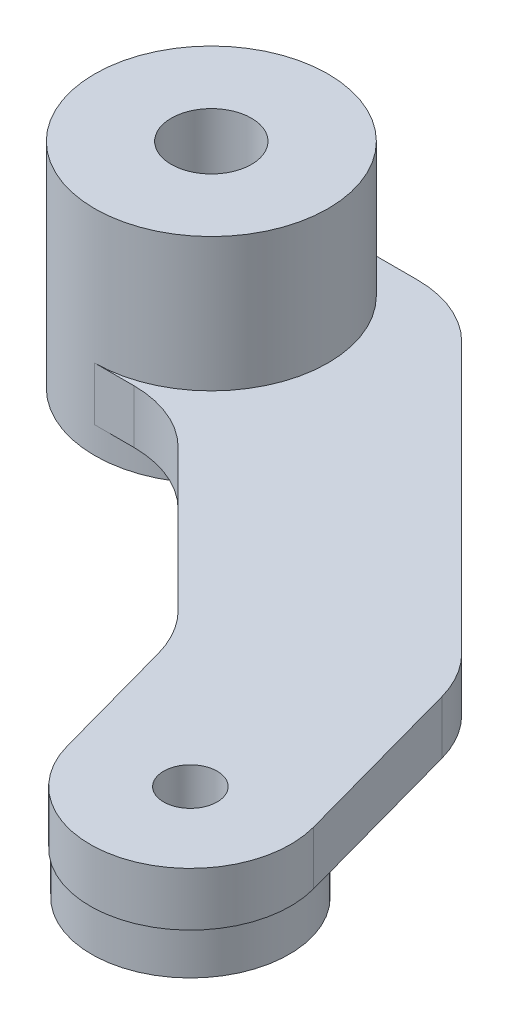
ISO-10303-21;
HEADER;
FILE_DESCRIPTION(('STEP AP214'),'2;1');
FILE_NAME('part.step','',(''),(''),'','','');
FILE_SCHEMA(('AUTOMOTIVE_DESIGN { 1 0 10303 214 1 1 1 1 }'));
ENDSEC;
DATA;
#1=APPLICATION_CONTEXT('core data for automotive mechanical design processes');
#2=APPLICATION_PROTOCOL_DEFINITION('international standard','automotive_design',2000,#1);
#3=PRODUCT_CONTEXT('',#1,'mechanical');
#4=PRODUCT('Part','Part','',(#3));
#5=PRODUCT_RELATED_PRODUCT_CATEGORY('part','',(#4));
#6=PRODUCT_DEFINITION_FORMATION('','',#4);
#7=PRODUCT_DEFINITION_CONTEXT('part definition',#1,'design');
#8=PRODUCT_DEFINITION('design','',#6,#7);
#9=PRODUCT_DEFINITION_SHAPE('','',#8);
#10=(LENGTH_UNIT() NAMED_UNIT(*) SI_UNIT(.MILLI.,.METRE.));
#11=(NAMED_UNIT(*) PLANE_ANGLE_UNIT() SI_UNIT($,.RADIAN.));
#12=(NAMED_UNIT(*) SI_UNIT($,.STERADIAN.) SOLID_ANGLE_UNIT());
#13=UNCERTAINTY_MEASURE_WITH_UNIT(LENGTH_MEASURE(1.E-05),#10,'distance_accuracy_value','');
#14=(GEOMETRIC_REPRESENTATION_CONTEXT(3) GLOBAL_UNCERTAINTY_ASSIGNED_CONTEXT((#13)) GLOBAL_UNIT_ASSIGNED_CONTEXT((#10,
#11,#12)) REPRESENTATION_CONTEXT('',''));
#15=CARTESIAN_POINT('',(0.,0.,0.));
#16=DIRECTION('',(0.,0.,1.));
#17=DIRECTION('',(1.,0.,0.));
#18=AXIS2_PLACEMENT_3D('',#15,#16,#17);
#19=CARTESIAN_POINT('',(0.,0.,0.));
#20=DIRECTION('',(0.,1.,0.));
#21=DIRECTION('',(0.,0.,1.));
#22=AXIS2_PLACEMENT_3D('',#19,#20,#21);
#23=PLANE('',#22);
#24=DIRECTION('',(0.714270427425469,0.,0.699869813969311));
#25=VECTOR('',#24,1.);
#26=CARTESIAN_POINT('',(2.33472867718182,0.,-2.38276836189749));
#27=LINE('',#26,#25);
#28=CARTESIAN_POINT('',(5.08889116016265,0.,0.315866651668403));
#29=VERTEX_POINT('',#28);
#30=CARTESIAN_POINT('',(13.2174816160493,0.,8.28057423546057));
#31=VERTEX_POINT('',#30);
#32=EDGE_CURVE('E406',#29,#31,#27,.T.);
#33=ORIENTED_EDGE('',*,*,#32,.F.);
#34=DIRECTION('',(-0.699869813969311,0.,0.714270427425469));
#35=VECTOR('',#34,1.);
#36=CARTESIAN_POINT('',(14.3721259194862,0.,-9.15838116854661));
#37=LINE('',#36,#35);
#38=CARTESIAN_POINT('',(4.38902134619334,0.,1.03013707909387));
#39=VERTEX_POINT('',#38);
#40=EDGE_CURVE('E479',#29,#39,#37,.T.);
#41=ORIENTED_EDGE('',*,*,#40,.T.);
#42=DIRECTION('',(-0.714270427425468,0.,-0.699869813969311));
#43=VECTOR('',#42,1.);
#44=CARTESIAN_POINT('',(1.63485886321251,0.,-1.66849793447202));
#45=LINE('',#44,#43);
#46=CARTESIAN_POINT('',(12.3516412815211,0.,8.83222032217718));
#47=VERTEX_POINT('',#46);
#48=EDGE_CURVE('E472',#47,#39,#45,.T.);
#49=ORIENTED_EDGE('',*,*,#48,.F.);
#50=DIRECTION('',(-0.332503401905546,0.,-0.943102055835549));
#51=VECTOR('',#50,1.);
#52=CARTESIAN_POINT('',(8.21641355024007,0.,-2.89680786932144));
#53=LINE('',#52,#51);
#54=CARTESIAN_POINT('',(13.823828400913,0.,13.0078849647527));
#55=VERTEX_POINT('',#54);
#56=EDGE_CURVE('E466',#55,#47,#53,.T.);
#57=ORIENTED_EDGE('',*,*,#56,.F.);
#58=CARTESIAN_POINT('',(15.5134984701017,0.,16.2966673040273));
#59=DIRECTION('',(0.,-1.,0.));
#60=DIRECTION('',(0.,0.,-1.));
#61=AXIS2_PLACEMENT_3D('',#58,#59,#60);
#62=CIRCLE('',#61,3.69744157733922);
#63=CARTESIAN_POINT('',(14.7669304567485,0.,12.6753815628471));
#64=VERTEX_POINT('',#63);
#65=EDGE_CURVE('E61',#64,#55,#62,.T.);
#66=ORIENTED_EDGE('',*,*,#65,.F.);
#67=DIRECTION('',(0.332503401905546,0.,0.943102055835549));
#68=VECTOR('',#67,1.);
#69=CARTESIAN_POINT('',(9.15951560607562,0.,-3.22931127122699));
#70=LINE('',#69,#68);
#71=EDGE_CURVE('E467',#31,#64,#70,.T.);
#72=ORIENTED_EDGE('',*,*,#71,.F.);
#73=EDGE_LOOP('',(#33,#41,#49,#57,#66,#72));
#74=FACE_BOUND('',#73,.T.);
#75=CARTESIAN_POINT('',(0.,0.,0.));
#76=DIRECTION('',(0.,-1.,0.));
#77=DIRECTION('',(0.,0.,-1.));
#78=AXIS2_PLACEMENT_3D('',#75,#76,#77);
#79=CIRCLE('',#78,4.365625);
#80=CARTESIAN_POINT('',(0.,0.,-4.365625));
#81=VERTEX_POINT('',#80);
#82=CARTESIAN_POINT('',(0.,0.,4.365625));
#83=VERTEX_POINT('',#82);
#84=EDGE_CURVE('E190',#81,#83,#79,.T.);
#85=ORIENTED_EDGE('',*,*,#84,.F.);
#86=DIRECTION('',(1.,0.,0.));
#87=VECTOR('',#86,1.);
#88=CARTESIAN_POINT('',(0.,0.,-4.365625));
#89=LINE('',#88,#87);
#90=CARTESIAN_POINT('',(3.3431457505076,0.,-4.365625));
#91=VERTEX_POINT('',#90);
#92=EDGE_CURVE('E360',#81,#91,#89,.T.);
#93=ORIENTED_EDGE('',*,*,#92,.T.);
#94=CARTESIAN_POINT('',(3.34314575050762,0.,-0.365625));
#95=DIRECTION('',(0.,1.,0.));
#96=DIRECTION('',(0.,0.,1.));
#97=AXIS2_PLACEMENT_3D('',#94,#95,#96);
#98=CIRCLE('',#97,4.);
#99=CARTESIAN_POINT('',(6.17157287525382,0.,-3.19405212474617));
#100=VERTEX_POINT('',#99);
#101=EDGE_CURVE('E357',#91,#100,#98,.F.);
#102=ORIENTED_EDGE('',*,*,#101,.T.);
#103=DIRECTION('',(0.707106781186546,0.,0.707106781186549));
#104=VECTOR('',#103,1.);
#105=CARTESIAN_POINT('',(4.68281250000001,0.,-4.68281249999999));
#106=LINE('',#105,#104);
#107=CARTESIAN_POINT('',(16.2738952249581,0.,6.90827022495812));
#108=VERTEX_POINT('',#107);
#109=EDGE_CURVE('E355',#100,#108,#106,.T.);
#110=ORIENTED_EDGE('',*,*,#109,.T.);
#111=CARTESIAN_POINT('',(13.4454681002119,0.,9.73669734970432));
#112=DIRECTION('',(0.,1.,0.));
#113=DIRECTION('',(0.,0.,1.));
#114=AXIS2_PLACEMENT_3D('',#111,#112,#113);
#115=CIRCLE('',#114,4.);
#116=CARTESIAN_POINT('',(17.3015809451535,0.,8.67349759092112));
#117=VERTEX_POINT('',#116);
#118=EDGE_CURVE('E352',#108,#117,#115,.F.);
#119=ORIENTED_EDGE('',*,*,#118,.T.);
#120=DIRECTION('',(0.265799939695803,0.,0.964028211235391));
#121=VECTOR('',#120,1.);
#122=CARTESIAN_POINT('',(13.8567458042872,0.,-3.82055437406726));
#123=LINE('',#122,#121);
#124=CARTESIAN_POINT('',(19.1286042622344,0.,15.299917530168));
#125=VERTEX_POINT('',#124);
#126=EDGE_CURVE('E349',#117,#125,#123,.T.);
#127=ORIENTED_EDGE('',*,*,#126,.T.);
#128=CARTESIAN_POINT('',(15.5134984701017,0.,16.2966673040273));
#129=DIRECTION('',(0.,1.,0.));
#130=DIRECTION('',(0.,0.,1.));
#131=AXIS2_PLACEMENT_3D('',#128,#129,#130);
#132=CIRCLE('',#131,3.75);
#133=CARTESIAN_POINT('',(11.898392677969,0.,17.2934170778865));
#134=VERTEX_POINT('',#133);
#135=EDGE_CURVE('E343',#134,#125,#132,.T.);
#136=ORIENTED_EDGE('',*,*,#135,.F.);
#137=DIRECTION('',(0.265799939695804,0.,0.964028211235391));
#138=VECTOR('',#137,1.);
#139=CARTESIAN_POINT('',(6.62653422002174,0.,-1.82705482634874));
#140=LINE('',#139,#138);
#141=CARTESIAN_POINT('',(10.5978049827296,0.,12.5763233462955));
#142=VERTEX_POINT('',#141);
#143=EDGE_CURVE('E341',#142,#134,#140,.T.);
#144=ORIENTED_EDGE('',*,*,#143,.F.);
#145=CARTESIAN_POINT('',(6.74169213778806,0.,13.6395231050787));
#146=DIRECTION('',(0.,1.,0.));
#147=DIRECTION('',(0.,0.,1.));
#148=AXIS2_PLACEMENT_3D('',#145,#146,#147);
#149=CIRCLE('',#148,4.);
#150=CARTESIAN_POINT('',(9.57011926253424,0.,10.8110959803325));
#151=VERTEX_POINT('',#150);
#152=EDGE_CURVE('E331',#151,#142,#149,.F.);
#153=ORIENTED_EDGE('',*,*,#152,.F.);
#154=DIRECTION('',(0.707106781186548,0.,0.707106781186548));
#155=VECTOR('',#154,1.);
#156=CARTESIAN_POINT('',(-0.62048835889911,0.,0.62048835889911));
#157=LINE('',#156,#155);
#158=CARTESIAN_POINT('',(4.2962211574556,0.,5.53719787525382));
#159=VERTEX_POINT('',#158);
#160=EDGE_CURVE('E321',#159,#151,#157,.T.);
#161=ORIENTED_EDGE('',*,*,#160,.F.);
#162=CARTESIAN_POINT('',(1.4677940327094,0.,8.365625));
#163=DIRECTION('',(0.,1.,0.));
#164=DIRECTION('',(0.,0.,1.));
#165=AXIS2_PLACEMENT_3D('',#162,#163,#164);
#166=CIRCLE('',#165,4.);
#167=CARTESIAN_POINT('',(1.46779403270938,0.,4.365625));
#168=VERTEX_POINT('',#167);
#169=EDGE_CURVE('E332',#159,#168,#166,.T.);
#170=ORIENTED_EDGE('',*,*,#169,.T.);
#171=DIRECTION('',(1.,0.,0.));
#172=VECTOR('',#171,1.);
#173=CARTESIAN_POINT('',(0.,0.,4.365625));
#174=LINE('',#173,#172);
#175=EDGE_CURVE('E363',#83,#168,#174,.T.);
#176=ORIENTED_EDGE('',*,*,#175,.F.);
#177=EDGE_LOOP('',(#85,#93,#102,#110,#119,#127,#136,#144,#153,#161,#170,#176));
#178=FACE_BOUND('',#177,.T.);
#179=ADVANCED_FACE('F39',(#74,#178),#23,.F.);
#180=CARTESIAN_POINT('',(9.15951560607562,-1.5875,-3.22931127122699));
#181=DIRECTION('',(-0.943102055835549,0.,0.332503401905546));
#182=DIRECTION('',(0.332503401905546,0.,0.943102055835549));
#183=AXIS2_PLACEMENT_3D('',#180,#181,#182);
#184=PLANE('',#183);
#185=DIRECTION('',(-0.330681069592284,0.104552607721741,-0.937933250520466));
#186=VECTOR('',#185,1.);
#187=CARTESIAN_POINT('',(9.16592610778326,0.183389429102031,-3.21112872841762));
#188=LINE('',#187,#186);
#189=CARTESIAN_POINT('',(14.7669304567485,-1.5875,12.6753815628471));
#190=VERTEX_POINT('',#189);
#191=CARTESIAN_POINT('',(13.2174816160493,-1.09760525934771,8.28057423546057));
#192=VERTEX_POINT('',#191);
#193=EDGE_CURVE('E393',#190,#192,#188,.T.);
#194=ORIENTED_EDGE('',*,*,#193,.T.);
#195=DIRECTION('',(0.,1.,0.));
#196=VECTOR('',#195,1.);
#197=CARTESIAN_POINT('',(13.2174816160493,-1.5875,8.28057423546057));
#198=LINE('',#197,#196);
#199=EDGE_CURVE('E400',#192,#31,#198,.T.);
#200=ORIENTED_EDGE('',*,*,#199,.T.);
#201=ORIENTED_EDGE('',*,*,#71,.T.);
#202=DIRECTION('',(0.,1.,0.));
#203=VECTOR('',#202,1.);
#204=CARTESIAN_POINT('',(14.7669304567485,-1.5875,12.6753815628471));
#205=LINE('',#204,#203);
#206=EDGE_CURVE('E401',#190,#64,#205,.T.);
#207=ORIENTED_EDGE('',*,*,#206,.F.);
#208=EDGE_LOOP('',(#194,#200,#201,#207));
#209=FACE_BOUND('',#208,.T.);
#210=ADVANCED_FACE('F257',(#209),#184,.F.);
#211=CARTESIAN_POINT('',(8.21641355024007,-1.5875,-2.89680786932144));
#212=DIRECTION('',(0.943102055835549,0.,-0.332503401905546));
#213=DIRECTION('',(-0.332503401905546,0.,-0.943102055835549));
#214=AXIS2_PLACEMENT_3D('',#211,#212,#213);
#215=PLANE('',#214);
#216=DIRECTION('',(-0.330681069592284,0.104552607721741,-0.937933250520466));
#217=VECTOR('',#216,1.);
#218=CARTESIAN_POINT('',(8.27770959138597,0.166036073249032,-2.72294973106486));
#219=LINE('',#218,#217);
#220=CARTESIAN_POINT('',(13.823828400913,-1.5875,13.0078849647527));
#221=VERTEX_POINT('',#220);
#222=CARTESIAN_POINT('',(12.3516412815211,-1.12203337205981,8.83222032217718));
#223=VERTEX_POINT('',#222);
#224=EDGE_CURVE('E395',#221,#223,#219,.T.);
#225=ORIENTED_EDGE('',*,*,#224,.F.);
#226=DIRECTION('',(0.,1.,0.));
#227=VECTOR('',#226,1.);
#228=CARTESIAN_POINT('',(13.823828400913,-1.5875,13.0078849647527));
#229=LINE('',#228,#227);
#230=EDGE_CURVE('E410',#221,#55,#229,.T.);
#231=ORIENTED_EDGE('',*,*,#230,.T.);
#232=ORIENTED_EDGE('',*,*,#56,.T.);
#233=DIRECTION('',(0.,1.,0.));
#234=VECTOR('',#233,1.);
#235=CARTESIAN_POINT('',(12.3516412815211,-1.5875,8.83222032217718));
#236=LINE('',#235,#234);
#237=EDGE_CURVE('E407',#223,#47,#236,.T.);
#238=ORIENTED_EDGE('',*,*,#237,.F.);
#239=EDGE_LOOP('',(#225,#231,#232,#238));
#240=FACE_BOUND('',#239,.T.);
#241=ADVANCED_FACE('F253',(#240),#215,.F.);
#242=CARTESIAN_POINT('',(1.63485886321251,-1.5875,-1.66849793447202));
#243=DIRECTION('',(0.699869813969311,0.,-0.714270427425468));
#244=DIRECTION('',(-0.714270427425468,0.,-0.699869813969311));
#245=AXIS2_PLACEMENT_3D('',#242,#243,#244);
#246=PLANE('',#245);
#247=ORIENTED_EDGE('',*,*,#48,.T.);
#248=CARTESIAN_POINT('',(4.82547040914751,-0.0461163851207022,1.4577867657788));
#249=CARTESIAN_POINT('',(4.69876645622606,-0.0280031988042814,1.33363732803722));
#250=CARTESIAN_POINT('',(4.51550134687671,0.,1.15406707976347));
#251=CARTESIAN_POINT('',(4.38902134619334,0.,1.03013707909387));
#252=B_SPLINE_CURVE_WITH_KNOTS('',3,(#248,#249,#250,#251),.UNSPECIFIED.,.F.,.F.,(4,4),(0.,1.),.UNSPECIFIED.);
#253=CARTESIAN_POINT('',(4.82547040914751,-0.0461163851207022,1.4577867657788));
#254=VERTEX_POINT('',#253);
#255=EDGE_CURVE('E478',#254,#39,#252,.T.);
#256=ORIENTED_EDGE('',*,*,#255,.F.);
#257=DIRECTION('',(-0.710575657353192,0.101581592182295,-0.696249535229137));
#258=VECTOR('',#257,1.);
#259=CARTESIAN_POINT('',(12.3516412815211,-1.12203337205981,8.83222032217718));
#260=LINE('',#259,#258);
#261=EDGE_CURVE('E212',#223,#254,#260,.T.);
#262=ORIENTED_EDGE('',*,*,#261,.F.);
#263=ORIENTED_EDGE('',*,*,#237,.T.);
#264=EDGE_LOOP('',(#247,#256,#262,#263));
#265=FACE_BOUND('',#264,.T.);
#266=ADVANCED_FACE('F249',(#265),#246,.F.);
#267=CARTESIAN_POINT('',(2.33472867718182,-1.5875,-2.38276836189749));
#268=DIRECTION('',(-0.699869813969311,0.,0.714270427425468));
#269=DIRECTION('',(0.714270427425469,0.,0.699869813969311));
#270=AXIS2_PLACEMENT_3D('',#267,#268,#269);
#271=PLANE('',#270);
#272=DIRECTION('',(-0.710575657353192,0.101581592182295,-0.696249535229137));
#273=VECTOR('',#272,1.);
#274=CARTESIAN_POINT('',(2.4789112604941,0.389391222395966,-2.24149268550683));
#275=LINE('',#274,#273);
#276=CARTESIAN_POINT('',(12.8806334603265,-1.09760525934771,7.95051737319994));
#277=VERTEX_POINT('',#276);
#278=CARTESIAN_POINT('',(5.52534022311682,-0.0461163851207024,0.743516338353334));
#279=VERTEX_POINT('',#278);
#280=EDGE_CURVE('E492',#277,#279,#275,.T.);
#281=ORIENTED_EDGE('',*,*,#280,.T.);
#282=CARTESIAN_POINT('',(5.52534022311682,-0.0461163851207022,0.743516338353331));
#283=CARTESIAN_POINT('',(5.39863627019537,-0.0280031988042814,0.619366900611748));
#284=CARTESIAN_POINT('',(5.21537116084603,0.,0.439796652337995));
#285=CARTESIAN_POINT('',(5.08889116016265,0.,0.315866651668401));
#286=B_SPLINE_CURVE_WITH_KNOTS('',3,(#282,#283,#284,#285),.UNSPECIFIED.,.F.,.F.,(4,4),(0.,1.),.UNSPECIFIED.);
#287=EDGE_CURVE('E402',#279,#29,#286,.T.);
#288=ORIENTED_EDGE('',*,*,#287,.T.);
#289=ORIENTED_EDGE('',*,*,#32,.T.);
#290=ORIENTED_EDGE('',*,*,#199,.F.);
#291=DIRECTION('',(0.714270427425469,0.,0.699869813969311));
#292=VECTOR('',#291,1.);
#293=CARTESIAN_POINT('',(2.33472867718182,-1.09760525934771,-2.38276836189749));
#294=LINE('',#293,#292);
#295=EDGE_CURVE('E47',#277,#192,#294,.T.);
#296=ORIENTED_EDGE('',*,*,#295,.F.);
#297=EDGE_LOOP('',(#281,#288,#289,#290,#296));
#298=FACE_BOUND('',#297,.T.);
#299=ADVANCED_FACE('F245',(#298),#271,.F.);
#300=CARTESIAN_POINT('',(0.,-1.5875,0.));
#301=DIRECTION('',(0.,-1.,0.));
#302=DIRECTION('',(0.,0.,-1.));
#303=AXIS2_PLACEMENT_3D('',#300,#301,#302);
#304=PLANE('',#303);
#305=CARTESIAN_POINT('',(15.5134984701017,-1.5875,16.2966673040273));
#306=DIRECTION('',(0.,-1.,0.));
#307=DIRECTION('',(0.,0.,-1.));
#308=AXIS2_PLACEMENT_3D('',#305,#306,#307);
#309=CIRCLE('',#308,1.00000000000001);
#310=CARTESIAN_POINT('',(15.5134984701017,-1.5875,15.2966673040273));
#311=VERTEX_POINT('',#310);
#312=EDGE_CURVE('E408',#311,#311,#309,.F.);
#313=ORIENTED_EDGE('',*,*,#312,.T.);
#314=EDGE_LOOP('',(#313));
#315=FACE_BOUND('',#314,.T.);
#316=CARTESIAN_POINT('',(15.5134984701017,-1.5875,16.2966673040273));
#317=DIRECTION('',(0.,-1.,0.));
#318=DIRECTION('',(0.,0.,-1.));
#319=AXIS2_PLACEMENT_3D('',#316,#317,#318);
#320=CIRCLE('',#319,3.69744157733922);
#321=EDGE_CURVE('E413',#190,#221,#320,.T.);
#322=ORIENTED_EDGE('',*,*,#321,.T.);
#323=DIRECTION('',(0.943102055835549,0.,-0.332503401905546));
#324=VECTOR('',#323,1.);
#325=CARTESIAN_POINT('',(5.6074148506729,-1.5875,15.9046928340741));
#326=LINE('',#325,#324);
#327=EDGE_CURVE('E384',#221,#190,#326,.T.);
#328=ORIENTED_EDGE('',*,*,#327,.T.);
#329=EDGE_LOOP('',(#322,#328));
#330=FACE_BOUND('',#329,.T.);
#331=ADVANCED_FACE('F242',(#315,#330),#304,.T.);
#332=CARTESIAN_POINT('',(1.4677940327094,2.,8.365625));
#333=DIRECTION('',(0.,-1.,0.));
#334=DIRECTION('',(0.,0.,-1.));
#335=AXIS2_PLACEMENT_3D('',#332,#333,#334);
#336=CYLINDRICAL_SURFACE('',#335,4.);
#337=ORIENTED_EDGE('',*,*,#169,.F.);
#338=DIRECTION('',(0.,-1.,0.));
#339=VECTOR('',#338,1.);
#340=CARTESIAN_POINT('',(4.2962211574556,2.,5.53719787525382));
#341=LINE('',#340,#339);
#342=CARTESIAN_POINT('',(4.2962211574556,2.,5.53719787525382));
#343=VERTEX_POINT('',#342);
#344=EDGE_CURVE('E326',#343,#159,#341,.T.);
#345=ORIENTED_EDGE('',*,*,#344,.F.);
#346=CARTESIAN_POINT('',(1.4677940327094,2.,8.365625));
#347=DIRECTION('',(0.,1.,0.));
#348=DIRECTION('',(0.,0.,1.));
#349=AXIS2_PLACEMENT_3D('',#346,#347,#348);
#350=CIRCLE('',#349,4.);
#351=CARTESIAN_POINT('',(1.46779403270938,2.,4.365625));
#352=VERTEX_POINT('',#351);
#353=EDGE_CURVE('E365',#343,#352,#350,.T.);
#354=ORIENTED_EDGE('',*,*,#353,.T.);
#355=DIRECTION('',(0.,-1.,0.));
#356=VECTOR('',#355,1.);
#357=CARTESIAN_POINT('',(1.46779403270938,2.,4.365625));
#358=LINE('',#357,#356);
#359=EDGE_CURVE('E176',#352,#168,#358,.T.);
#360=ORIENTED_EDGE('',*,*,#359,.T.);
#361=EDGE_LOOP('',(#337,#345,#354,#360));
#362=FACE_BOUND('',#361,.T.);
#363=ADVANCED_FACE('F41',(#362),#336,.F.);
#364=CARTESIAN_POINT('',(-0.62048835889911,2.,0.62048835889911));
#365=DIRECTION('',(0.707106781186547,0.,-0.707106781186547));
#366=DIRECTION('',(-0.707106781186548,0.,-0.707106781186548));
#367=AXIS2_PLACEMENT_3D('',#364,#365,#366);
#368=PLANE('',#367);
#369=ORIENTED_EDGE('',*,*,#160,.T.);
#370=DIRECTION('',(0.,-1.,0.));
#371=VECTOR('',#370,1.);
#372=CARTESIAN_POINT('',(9.57011926253424,2.,10.8110959803325));
#373=LINE('',#372,#371);
#374=CARTESIAN_POINT('',(9.57011926253424,2.,10.8110959803325));
#375=VERTEX_POINT('',#374);
#376=EDGE_CURVE('E324',#375,#151,#373,.T.);
#377=ORIENTED_EDGE('',*,*,#376,.F.);
#378=DIRECTION('',(0.707106781186548,0.,0.707106781186548));
#379=VECTOR('',#378,1.);
#380=CARTESIAN_POINT('',(-0.62048835889911,2.,0.62048835889911));
#381=LINE('',#380,#379);
#382=EDGE_CURVE('E422',#343,#375,#381,.T.);
#383=ORIENTED_EDGE('',*,*,#382,.F.);
#384=ORIENTED_EDGE('',*,*,#344,.T.);
#385=EDGE_LOOP('',(#369,#377,#383,#384));
#386=FACE_BOUND('',#385,.T.);
#387=ADVANCED_FACE('F311',(#386),#368,.F.);
#388=CARTESIAN_POINT('',(6.74169213778806,2.,13.6395231050787));
#389=DIRECTION('',(0.,-1.,0.));
#390=DIRECTION('',(0.,0.,-1.));
#391=AXIS2_PLACEMENT_3D('',#388,#389,#390);
#392=CYLINDRICAL_SURFACE('',#391,4.);
#393=ORIENTED_EDGE('',*,*,#152,.T.);
#394=DIRECTION('',(0.,-1.,0.));
#395=VECTOR('',#394,1.);
#396=CARTESIAN_POINT('',(10.5978049827296,2.,12.5763233462955));
#397=LINE('',#396,#395);
#398=CARTESIAN_POINT('',(10.5978049827296,2.,12.5763233462955));
#399=VERTEX_POINT('',#398);
#400=EDGE_CURVE('E337',#399,#142,#397,.T.);
#401=ORIENTED_EDGE('',*,*,#400,.F.);
#402=CARTESIAN_POINT('',(6.74169213778806,2.,13.6395231050787));
#403=DIRECTION('',(0.,1.,0.));
#404=DIRECTION('',(0.,0.,1.));
#405=AXIS2_PLACEMENT_3D('',#402,#403,#404);
#406=CIRCLE('',#405,4.);
#407=EDGE_CURVE('E336',#375,#399,#406,.F.);
#408=ORIENTED_EDGE('',*,*,#407,.F.);
#409=ORIENTED_EDGE('',*,*,#376,.T.);
#410=EDGE_LOOP('',(#393,#401,#408,#409));
#411=FACE_BOUND('',#410,.T.);
#412=ADVANCED_FACE('F308',(#411),#392,.F.);
#413=CARTESIAN_POINT('',(6.62653422002174,2.,-1.82705482634874));
#414=DIRECTION('',(0.964028211235391,0.,-0.265799939695804));
#415=DIRECTION('',(-0.265799939695804,0.,-0.964028211235391));
#416=AXIS2_PLACEMENT_3D('',#413,#414,#415);
#417=PLANE('',#416);
#418=ORIENTED_EDGE('',*,*,#143,.T.);
#419=DIRECTION('',(0.,-1.,0.));
#420=VECTOR('',#419,1.);
#421=CARTESIAN_POINT('',(11.898392677969,2.,17.2934170778865));
#422=LINE('',#421,#420);
#423=CARTESIAN_POINT('',(11.898392677969,2.,17.2934170778865));
#424=VERTEX_POINT('',#423);
#425=EDGE_CURVE('E379',#424,#134,#422,.T.);
#426=ORIENTED_EDGE('',*,*,#425,.F.);
#427=DIRECTION('',(0.265799939695804,0.,0.964028211235391));
#428=VECTOR('',#427,1.);
#429=CARTESIAN_POINT('',(6.62653422002174,2.,-1.82705482634874));
#430=LINE('',#429,#428);
#431=EDGE_CURVE('E425',#399,#424,#430,.T.);
#432=ORIENTED_EDGE('',*,*,#431,.F.);
#433=ORIENTED_EDGE('',*,*,#400,.T.);
#434=EDGE_LOOP('',(#418,#426,#432,#433));
#435=FACE_BOUND('',#434,.T.);
#436=ADVANCED_FACE('F304',(#435),#417,.F.);
#437=CARTESIAN_POINT('',(15.5134984701017,2.,16.2966673040273));
#438=DIRECTION('',(0.,-1.,0.));
#439=DIRECTION('',(0.,0.,-1.));
#440=AXIS2_PLACEMENT_3D('',#437,#438,#439);
#441=CYLINDRICAL_SURFACE('',#440,3.75);
#442=ORIENTED_EDGE('',*,*,#135,.T.);
#443=DIRECTION('',(0.,-1.,0.));
#444=VECTOR('',#443,1.);
#445=CARTESIAN_POINT('',(19.1286042622344,2.,15.299917530168));
#446=LINE('',#445,#444);
#447=CARTESIAN_POINT('',(19.1286042622344,2.,15.299917530168));
#448=VERTEX_POINT('',#447);
#449=EDGE_CURVE('E377',#448,#125,#446,.T.);
#450=ORIENTED_EDGE('',*,*,#449,.F.);
#451=CARTESIAN_POINT('',(15.5134984701017,2.,16.2966673040273));
#452=DIRECTION('',(0.,1.,0.));
#453=DIRECTION('',(0.,0.,1.));
#454=AXIS2_PLACEMENT_3D('',#451,#452,#453);
#455=CIRCLE('',#454,3.75);
#456=EDGE_CURVE('E427',#424,#448,#455,.T.);
#457=ORIENTED_EDGE('',*,*,#456,.F.);
#458=ORIENTED_EDGE('',*,*,#425,.T.);
#459=EDGE_LOOP('',(#442,#450,#457,#458));
#460=FACE_BOUND('',#459,.T.);
#461=ADVANCED_FACE('F300',(#460),#441,.T.);
#462=CARTESIAN_POINT('',(13.8567458042872,2.,-3.82055437406726));
#463=DIRECTION('',(0.964028211235391,0.,-0.265799939695803));
#464=DIRECTION('',(-0.265799939695803,0.,-0.964028211235391));
#465=AXIS2_PLACEMENT_3D('',#462,#463,#464);
#466=PLANE('',#465);
#467=ORIENTED_EDGE('',*,*,#126,.F.);
#468=DIRECTION('',(0.,-1.,0.));
#469=VECTOR('',#468,1.);
#470=CARTESIAN_POINT('',(17.3015809451535,2.,8.67349759092112));
#471=LINE('',#470,#469);
#472=CARTESIAN_POINT('',(17.3015809451535,2.,8.67349759092112));
#473=VERTEX_POINT('',#472);
#474=EDGE_CURVE('E375',#473,#117,#471,.T.);
#475=ORIENTED_EDGE('',*,*,#474,.F.);
#476=DIRECTION('',(0.265799939695803,0.,0.964028211235391));
#477=VECTOR('',#476,1.);
#478=CARTESIAN_POINT('',(13.8567458042872,2.,-3.82055437406726));
#479=LINE('',#478,#477);
#480=EDGE_CURVE('E429',#473,#448,#479,.T.);
#481=ORIENTED_EDGE('',*,*,#480,.T.);
#482=ORIENTED_EDGE('',*,*,#449,.T.);
#483=EDGE_LOOP('',(#467,#475,#481,#482));
#484=FACE_BOUND('',#483,.T.);
#485=ADVANCED_FACE('F296',(#484),#466,.T.);
#486=CARTESIAN_POINT('',(13.4454681002119,2.,9.73669734970432));
#487=DIRECTION('',(0.,-1.,0.));
#488=DIRECTION('',(0.,0.,-1.));
#489=AXIS2_PLACEMENT_3D('',#486,#487,#488);
#490=CYLINDRICAL_SURFACE('',#489,4.);
#491=ORIENTED_EDGE('',*,*,#118,.F.);
#492=DIRECTION('',(0.,-1.,0.));
#493=VECTOR('',#492,1.);
#494=CARTESIAN_POINT('',(16.2738952249581,2.,6.90827022495812));
#495=LINE('',#494,#493);
#496=CARTESIAN_POINT('',(16.2738952249581,2.,6.90827022495812));
#497=VERTEX_POINT('',#496);
#498=EDGE_CURVE('E372',#497,#108,#495,.T.);
#499=ORIENTED_EDGE('',*,*,#498,.F.);
#500=CARTESIAN_POINT('',(13.4454681002119,2.,9.73669734970432));
#501=DIRECTION('',(0.,1.,0.));
#502=DIRECTION('',(0.,0.,1.));
#503=AXIS2_PLACEMENT_3D('',#500,#501,#502);
#504=CIRCLE('',#503,4.);
#505=EDGE_CURVE('E432',#497,#473,#504,.F.);
#506=ORIENTED_EDGE('',*,*,#505,.T.);
#507=ORIENTED_EDGE('',*,*,#474,.T.);
#508=EDGE_LOOP('',(#491,#499,#506,#507));
#509=FACE_BOUND('',#508,.T.);
#510=ADVANCED_FACE('F292',(#509),#490,.T.);
#511=CARTESIAN_POINT('',(4.68281250000001,2.,-4.68281249999999));
#512=DIRECTION('',(0.707106781186549,0.,-0.707106781186546));
#513=DIRECTION('',(-0.707106781186546,0.,-0.707106781186549));
#514=AXIS2_PLACEMENT_3D('',#511,#512,#513);
#515=PLANE('',#514);
#516=ORIENTED_EDGE('',*,*,#109,.F.);
#517=DIRECTION('',(0.,-1.,0.));
#518=VECTOR('',#517,1.);
#519=CARTESIAN_POINT('',(6.17157287525382,2.,-3.19405212474617));
#520=LINE('',#519,#518);
#521=CARTESIAN_POINT('',(6.17157287525382,2.,-3.19405212474617));
#522=VERTEX_POINT('',#521);
#523=EDGE_CURVE('E370',#522,#100,#520,.T.);
#524=ORIENTED_EDGE('',*,*,#523,.F.);
#525=DIRECTION('',(0.707106781186546,0.,0.707106781186549));
#526=VECTOR('',#525,1.);
#527=CARTESIAN_POINT('',(4.68281250000001,2.,-4.68281249999999));
#528=LINE('',#527,#526);
#529=EDGE_CURVE('E435',#522,#497,#528,.T.);
#530=ORIENTED_EDGE('',*,*,#529,.T.);
#531=ORIENTED_EDGE('',*,*,#498,.T.);
#532=EDGE_LOOP('',(#516,#524,#530,#531));
#533=FACE_BOUND('',#532,.T.);
#534=ADVANCED_FACE('F288',(#533),#515,.T.);
#535=CARTESIAN_POINT('',(3.34314575050762,2.,-0.365625));
#536=DIRECTION('',(0.,-1.,0.));
#537=DIRECTION('',(0.,0.,-1.));
#538=AXIS2_PLACEMENT_3D('',#535,#536,#537);
#539=CYLINDRICAL_SURFACE('',#538,4.);
#540=ORIENTED_EDGE('',*,*,#101,.F.);
#541=DIRECTION('',(0.,-1.,0.));
#542=VECTOR('',#541,1.);
#543=CARTESIAN_POINT('',(3.3431457505076,2.,-4.365625));
#544=LINE('',#543,#542);
#545=CARTESIAN_POINT('',(3.3431457505076,2.,-4.365625));
#546=VERTEX_POINT('',#545);
#547=EDGE_CURVE('E368',#546,#91,#544,.T.);
#548=ORIENTED_EDGE('',*,*,#547,.F.);
#549=CARTESIAN_POINT('',(3.34314575050762,2.,-0.365625));
#550=DIRECTION('',(0.,1.,0.));
#551=DIRECTION('',(0.,0.,1.));
#552=AXIS2_PLACEMENT_3D('',#549,#550,#551);
#553=CIRCLE('',#552,4.);
#554=EDGE_CURVE('E438',#546,#522,#553,.F.);
#555=ORIENTED_EDGE('',*,*,#554,.T.);
#556=ORIENTED_EDGE('',*,*,#523,.T.);
#557=EDGE_LOOP('',(#540,#548,#555,#556));
#558=FACE_BOUND('',#557,.T.);
#559=ADVANCED_FACE('F284',(#558),#539,.T.);
#560=CARTESIAN_POINT('',(0.,2.,-4.365625));
#561=DIRECTION('',(0.,0.,-1.));
#562=DIRECTION('',(-1.,0.,0.));
#563=AXIS2_PLACEMENT_3D('',#560,#561,#562);
#564=PLANE('',#563);
#565=ORIENTED_EDGE('',*,*,#92,.F.);
#566=DIRECTION('',(0.,-1.,0.));
#567=VECTOR('',#566,1.);
#568=CARTESIAN_POINT('',(0.,2.,-4.365625));
#569=LINE('',#568,#567);
#570=CARTESIAN_POINT('',(0.,2.,-4.365625));
#571=VERTEX_POINT('',#570);
#572=EDGE_CURVE('E191',#571,#81,#569,.T.);
#573=ORIENTED_EDGE('',*,*,#572,.F.);
#574=DIRECTION('',(1.,0.,0.));
#575=VECTOR('',#574,1.);
#576=CARTESIAN_POINT('',(0.,2.,-4.365625));
#577=LINE('',#576,#575);
#578=EDGE_CURVE('E182',#571,#546,#577,.T.);
#579=ORIENTED_EDGE('',*,*,#578,.T.);
#580=ORIENTED_EDGE('',*,*,#547,.T.);
#581=EDGE_LOOP('',(#565,#573,#579,#580));
#582=FACE_BOUND('',#581,.T.);
#583=ADVANCED_FACE('F281',(#582),#564,.T.);
#584=CARTESIAN_POINT('',(0.,2.,0.));
#585=DIRECTION('',(0.,-1.,0.));
#586=DIRECTION('',(0.,0.,-1.));
#587=AXIS2_PLACEMENT_3D('',#584,#585,#586);
#588=CYLINDRICAL_SURFACE('',#587,4.365625);
#589=ORIENTED_EDGE('',*,*,#572,.T.);
#590=ORIENTED_EDGE('',*,*,#84,.T.);
#591=DIRECTION('',(0.,-1.,0.));
#592=VECTOR('',#591,1.);
#593=CARTESIAN_POINT('',(0.,2.,4.365625));
#594=LINE('',#593,#592);
#595=CARTESIAN_POINT('',(0.,2.,4.365625));
#596=VERTEX_POINT('',#595);
#597=EDGE_CURVE('E174',#596,#83,#594,.T.);
#598=ORIENTED_EDGE('',*,*,#597,.F.);
#599=CARTESIAN_POINT('',(0.,2.,0.));
#600=DIRECTION('',(0.,1.,0.));
#601=DIRECTION('',(0.,0.,1.));
#602=AXIS2_PLACEMENT_3D('',#599,#600,#601);
#603=CIRCLE('',#602,4.365625);
#604=EDGE_CURVE('E189',#596,#571,#603,.T.);
#605=ORIENTED_EDGE('',*,*,#604,.T.);
#606=EDGE_LOOP('',(#589,#590,#598,#605));
#607=FACE_BOUND('',#606,.T.);
#608=CARTESIAN_POINT('',(0.,-1.,0.));
#609=DIRECTION('',(0.,-1.,0.));
#610=DIRECTION('',(0.,0.,-1.));
#611=AXIS2_PLACEMENT_3D('',#608,#609,#610);
#612=CIRCLE('',#611,4.365625);
#613=CARTESIAN_POINT('',(0.,-1.,-4.365625));
#614=VERTEX_POINT('',#613);
#615=EDGE_CURVE('E209',#614,#614,#612,.T.);
#616=ORIENTED_EDGE('',*,*,#615,.F.);
#617=EDGE_LOOP('',(#616));
#618=FACE_BOUND('',#617,.T.);
#619=CARTESIAN_POINT('',(0.,7.,0.));
#620=DIRECTION('',(0.,1.,0.));
#621=DIRECTION('',(0.,0.,1.));
#622=AXIS2_PLACEMENT_3D('',#619,#620,#621);
#623=CIRCLE('',#622,4.365625);
#624=CARTESIAN_POINT('',(0.,7.,4.365625));
#625=VERTEX_POINT('',#624);
#626=EDGE_CURVE('E198',#625,#625,#623,.T.);
#627=ORIENTED_EDGE('',*,*,#626,.F.);
#628=EDGE_LOOP('',(#627));
#629=FACE_BOUND('',#628,.T.);
#630=ADVANCED_FACE('F187',(#607,#618,#629),#588,.T.);
#631=CARTESIAN_POINT('',(0.,2.,0.));
#632=DIRECTION('',(0.,-1.,0.));
#633=DIRECTION('',(0.,0.,-1.));
#634=AXIS2_PLACEMENT_3D('',#631,#632,#633);
#635=CYLINDRICAL_SURFACE('',#634,1.5);
#636=CARTESIAN_POINT('',(0.,-1.,0.));
#637=DIRECTION('',(0.,-1.,0.));
#638=DIRECTION('',(0.,0.,-1.));
#639=AXIS2_PLACEMENT_3D('',#636,#637,#638);
#640=CIRCLE('',#639,1.5);
#641=CARTESIAN_POINT('',(0.,-1.,-1.5));
#642=VERTEX_POINT('',#641);
#643=EDGE_CURVE('E202',#642,#642,#640,.T.);
#644=ORIENTED_EDGE('',*,*,#643,.T.);
#645=EDGE_LOOP('',(#644));
#646=FACE_BOUND('',#645,.T.);
#647=CARTESIAN_POINT('',(0.,7.,0.));
#648=DIRECTION('',(0.,1.,0.));
#649=DIRECTION('',(0.,0.,1.));
#650=AXIS2_PLACEMENT_3D('',#647,#648,#649);
#651=CIRCLE('',#650,1.5);
#652=CARTESIAN_POINT('',(0.,7.,1.5));
#653=VERTEX_POINT('',#652);
#654=EDGE_CURVE('E199',#653,#653,#651,.T.);
#655=ORIENTED_EDGE('',*,*,#654,.T.);
#656=EDGE_LOOP('',(#655));
#657=FACE_BOUND('',#656,.T.);
#658=ADVANCED_FACE('F273',(#646,#657),#635,.F.);
#659=CARTESIAN_POINT('',(0.,2.,4.365625));
#660=DIRECTION('',(0.,0.,-1.));
#661=DIRECTION('',(-1.,0.,0.));
#662=AXIS2_PLACEMENT_3D('',#659,#660,#661);
#663=PLANE('',#662);
#664=ORIENTED_EDGE('',*,*,#175,.T.);
#665=ORIENTED_EDGE('',*,*,#359,.F.);
#666=DIRECTION('',(1.,0.,0.));
#667=VECTOR('',#666,1.);
#668=CARTESIAN_POINT('',(0.,2.,4.365625));
#669=LINE('',#668,#667);
#670=EDGE_CURVE('E170',#596,#352,#669,.T.);
#671=ORIENTED_EDGE('',*,*,#670,.F.);
#672=ORIENTED_EDGE('',*,*,#597,.T.);
#673=EDGE_LOOP('',(#664,#665,#671,#672));
#674=FACE_BOUND('',#673,.T.);
#675=ADVANCED_FACE('F173',(#674),#663,.F.);
#676=CARTESIAN_POINT('',(15.5134984701017,2.,16.2966673040273));
#677=DIRECTION('',(0.,-1.,0.));
#678=DIRECTION('',(0.,0.,-1.));
#679=AXIS2_PLACEMENT_3D('',#676,#677,#678);
#680=CYLINDRICAL_SURFACE('',#679,1.00000000000001);
#681=CARTESIAN_POINT('',(15.5134984701017,2.,16.2966673040273));
#682=DIRECTION('',(0.,1.,0.));
#683=DIRECTION('',(0.,0.,1.));
#684=AXIS2_PLACEMENT_3D('',#681,#682,#683);
#685=CIRCLE('',#684,1.00000000000001);
#686=CARTESIAN_POINT('',(15.5134984701017,2.,17.2966673040273));
#687=VERTEX_POINT('',#686);
#688=EDGE_CURVE('E181',#687,#687,#685,.T.);
#689=ORIENTED_EDGE('',*,*,#688,.T.);
#690=EDGE_LOOP('',(#689));
#691=FACE_BOUND('',#690,.T.);
#692=ORIENTED_EDGE('',*,*,#312,.F.);
#693=EDGE_LOOP('',(#692));
#694=FACE_BOUND('',#693,.T.);
#695=ADVANCED_FACE('F267',(#691,#694),#680,.F.);
#696=CARTESIAN_POINT('',(0.,2.,0.));
#697=DIRECTION('',(0.,1.,0.));
#698=DIRECTION('',(0.,0.,1.));
#699=AXIS2_PLACEMENT_3D('',#696,#697,#698);
#700=PLANE('',#699);
#701=ORIENTED_EDGE('',*,*,#604,.F.);
#702=ORIENTED_EDGE('',*,*,#670,.T.);
#703=ORIENTED_EDGE('',*,*,#353,.F.);
#704=ORIENTED_EDGE('',*,*,#382,.T.);
#705=ORIENTED_EDGE('',*,*,#407,.T.);
#706=ORIENTED_EDGE('',*,*,#431,.T.);
#707=ORIENTED_EDGE('',*,*,#456,.T.);
#708=ORIENTED_EDGE('',*,*,#480,.F.);
#709=ORIENTED_EDGE('',*,*,#505,.F.);
#710=ORIENTED_EDGE('',*,*,#529,.F.);
#711=ORIENTED_EDGE('',*,*,#554,.F.);
#712=ORIENTED_EDGE('',*,*,#578,.F.);
#713=EDGE_LOOP('',(#701,#702,#703,#704,#705,#706,#707,#708,#709,#710,#711,#712));
#714=FACE_BOUND('',#713,.T.);
#715=ORIENTED_EDGE('',*,*,#688,.F.);
#716=EDGE_LOOP('',(#715));
#717=FACE_BOUND('',#716,.T.);
#718=ADVANCED_FACE('F194',(#714,#717),#700,.T.);
#719=CARTESIAN_POINT('',(15.5134984701017,-1.5875,16.2966673040273));
#720=DIRECTION('',(0.,1.,0.));
#721=DIRECTION('',(0.,0.,1.));
#722=AXIS2_PLACEMENT_3D('',#719,#720,#721);
#723=CYLINDRICAL_SURFACE('',#722,3.69744157733922);
#724=ORIENTED_EDGE('',*,*,#65,.T.);
#725=ORIENTED_EDGE('',*,*,#230,.F.);
#726=ORIENTED_EDGE('',*,*,#321,.F.);
#727=ORIENTED_EDGE('',*,*,#206,.T.);
#728=EDGE_LOOP('',(#724,#725,#726,#727));
#729=FACE_BOUND('',#728,.T.);
#730=ADVANCED_FACE('F240',(#729),#723,.T.);
#731=CARTESIAN_POINT('',(-10.169294982844,-1.09760525934771,3.58532266561641));
#732=DIRECTION('',(0.,-1.,0.));
#733=DIRECTION('',(0.,0.,-1.));
#734=AXIS2_PLACEMENT_3D('',#731,#732,#733);
#735=PLANE('',#734);
#736=DIRECTION('',(-0.699869813969311,0.,0.714270427425469));
#737=VECTOR('',#736,1.);
#738=CARTESIAN_POINT('',(3.77251395452439,-1.09760525934771,17.2460467453766));
#739=LINE('',#738,#737);
#740=CARTESIAN_POINT('',(12.2087640243848,-1.09760525934771,8.63621128313221));
#741=VERTEX_POINT('',#740);
#742=EDGE_CURVE('E53',#277,#741,#739,.T.);
#743=ORIENTED_EDGE('',*,*,#742,.F.);
#744=ORIENTED_EDGE('',*,*,#295,.T.);
#745=DIRECTION('',(0.943102055835549,0.,-0.332503401905546));
#746=VECTOR('',#745,1.);
#747=CARTESIAN_POINT('',(-6.11132897287031,-1.09760525934771,15.095208172304));
#748=LINE('',#747,#746);
#749=EDGE_CURVE('E389',#741,#192,#748,.T.);
#750=ORIENTED_EDGE('',*,*,#749,.F.);
#751=EDGE_LOOP('',(#743,#744,#750));
#752=FACE_BOUND('',#751,.T.);
#753=ADVANCED_FACE('F236',(#752),#735,.T.);
#754=CARTESIAN_POINT('',(-10.1628844811364,0.183389429102031,3.60350520842577));
#755=DIRECTION('',(-0.0347640977455748,-0.994519357387569,-0.0986037792853412));
#756=DIRECTION('',(0.,0.0986634167751913,-0.995120862101808));
#757=AXIS2_PLACEMENT_3D('',#754,#755,#756);
#758=PLANE('',#757);
#759=DIRECTION('',(0.586083583958005,-0.100204302172301,0.804030553176372));
#760=VECTOR('',#759,1.);
#761=CARTESIAN_POINT('',(2.07744974703828,0.634573059645305,-5.26263599016439));
#762=LINE('',#761,#760);
#763=EDGE_CURVE('E11',#741,#223,#762,.T.);
#764=ORIENTED_EDGE('',*,*,#763,.F.);
#765=ORIENTED_EDGE('',*,*,#749,.T.);
#766=ORIENTED_EDGE('',*,*,#193,.F.);
#767=ORIENTED_EDGE('',*,*,#327,.F.);
#768=ORIENTED_EDGE('',*,*,#224,.T.);
#769=EDGE_LOOP('',(#764,#765,#766,#767,#768));
#770=FACE_BOUND('',#769,.T.);
#771=ADVANCED_FACE('F228',(#770),#758,.T.);
#772=CARTESIAN_POINT('',(14.8085749824404,-0.0461163851207022,-8.73073148186168));
#773=CARTESIAN_POINT('',(14.681871029519,-0.0280031988042814,-8.85488091960326));
#774=CARTESIAN_POINT('',(14.4986059201696,0.,-9.03445116787701));
#775=CARTESIAN_POINT('',(14.3721259194862,0.,-9.15838116854661));
#776=B_SPLINE_CURVE_WITH_KNOTS('',3,(#772,#773,#774,#775),.UNSPECIFIED.,.F.,.F.,(4,4),(0.,1.),.UNSPECIFIED.);
#777=DIRECTION('',(-0.699869813969311,0.,0.714270427425469));
#778=VECTOR('',#777,1.);
#779=SURFACE_OF_LINEAR_EXTRUSION('',#776,#778);
#780=DIRECTION('',(-0.699869813969311,0.,0.714270427425469));
#781=VECTOR('',#780,1.);
#782=CARTESIAN_POINT('',(14.8085749824404,-0.0461163851207022,-8.73073148186168));
#783=LINE('',#782,#781);
#784=EDGE_CURVE('E480',#279,#254,#783,.T.);
#785=ORIENTED_EDGE('',*,*,#784,.T.);
#786=ORIENTED_EDGE('',*,*,#255,.T.);
#787=ORIENTED_EDGE('',*,*,#40,.F.);
#788=ORIENTED_EDGE('',*,*,#287,.F.);
#789=EDGE_LOOP('',(#785,#786,#787,#788));
#790=FACE_BOUND('',#789,.T.);
#791=ADVANCED_FACE('F223',(#790),#779,.F.);
#792=CARTESIAN_POINT('',(22.334745854814,-1.12203337205981,-1.3562979254633));
#793=DIRECTION('',(0.0725567272666074,0.994827211192833,0.0710938900233291));
#794=DIRECTION('',(-0.997350879924123,0.0727407885204486,0.));
#795=AXIS2_PLACEMENT_3D('',#792,#793,#794);
#796=PLANE('',#795);
#797=ORIENTED_EDGE('',*,*,#742,.T.);
#798=ORIENTED_EDGE('',*,*,#763,.T.);
#799=ORIENTED_EDGE('',*,*,#261,.T.);
#800=ORIENTED_EDGE('',*,*,#784,.F.);
#801=ORIENTED_EDGE('',*,*,#280,.F.);
#802=EDGE_LOOP('',(#797,#798,#799,#800,#801));
#803=FACE_BOUND('',#802,.T.);
#804=ADVANCED_FACE('F227',(#803),#796,.F.);
#805=CARTESIAN_POINT('',(0.,-1.,0.));
#806=DIRECTION('',(0.,-1.,0.));
#807=DIRECTION('',(0.,0.,-1.));
#808=AXIS2_PLACEMENT_3D('',#805,#806,#807);
#809=PLANE('',#808);
#810=ORIENTED_EDGE('',*,*,#615,.T.);
#811=EDGE_LOOP('',(#810));
#812=FACE_BOUND('',#811,.T.);
#813=ORIENTED_EDGE('',*,*,#643,.F.);
#814=EDGE_LOOP('',(#813));
#815=FACE_BOUND('',#814,.T.);
#816=ADVANCED_FACE('F230',(#812,#815),#809,.T.);
#817=CARTESIAN_POINT('',(0.,7.,0.));
#818=DIRECTION('',(0.,1.,0.));
#819=DIRECTION('',(0.,0.,1.));
#820=AXIS2_PLACEMENT_3D('',#817,#818,#819);
#821=PLANE('',#820);
#822=ORIENTED_EDGE('',*,*,#626,.T.);
#823=EDGE_LOOP('',(#822));
#824=FACE_BOUND('',#823,.T.);
#825=ORIENTED_EDGE('',*,*,#654,.F.);
#826=EDGE_LOOP('',(#825));
#827=FACE_BOUND('',#826,.T.);
#828=ADVANCED_FACE('F551',(#824,#827),#821,.T.);
#829=CLOSED_SHELL('',(#179,#210,#241,#266,#299,#331,#363,#387,#412,#436,#461,#485,#510,#534,
#559,#583,#630,#658,#675,#695,#718,#730,#753,#771,#791,#804,#816,#828));
#830=MANIFOLD_SOLID_BREP('B2',#829);
#831=ADVANCED_BREP_SHAPE_REPRESENTATION('',(#18,#830),#14);
#832=SHAPE_DEFINITION_REPRESENTATION(#9,#831);
ENDSEC;
END-ISO-10303-21;
